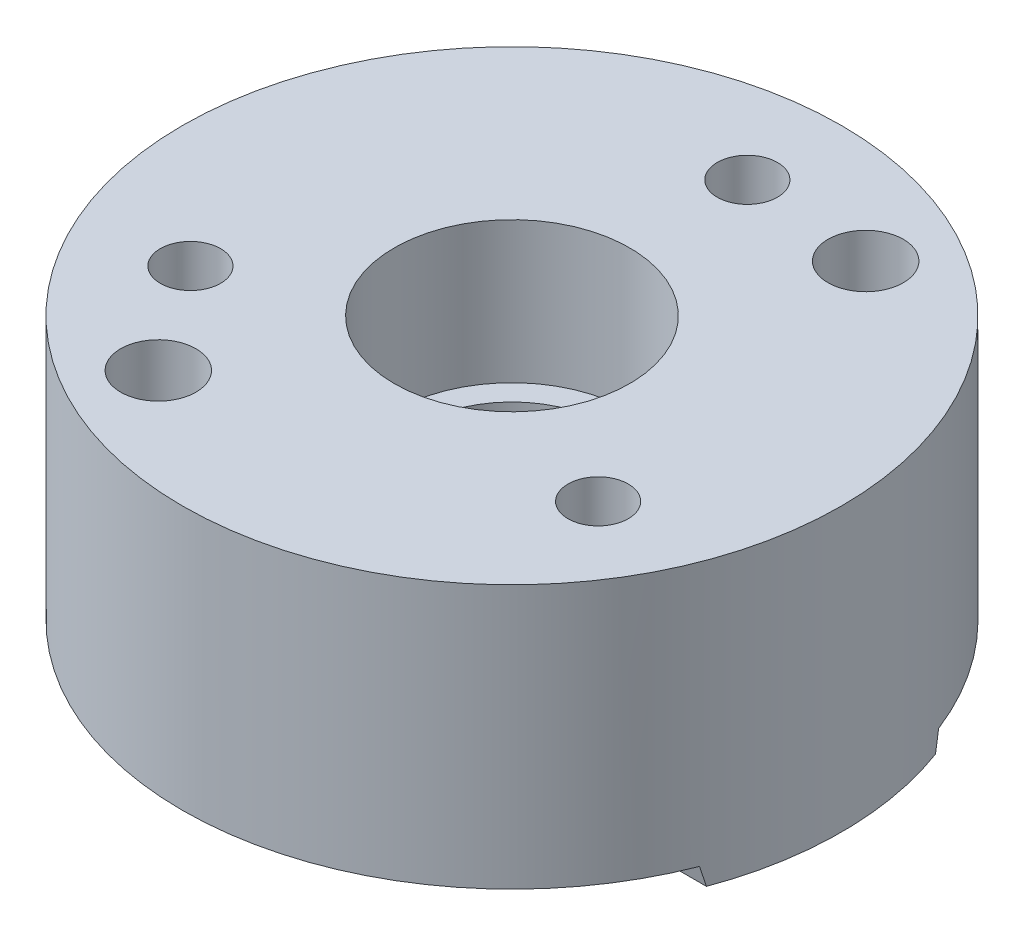
ISO-10303-21;
HEADER;
FILE_DESCRIPTION(('STEP AP214'),'2;1');
FILE_NAME('part.step','',(''),(''),'','','');
FILE_SCHEMA(('AUTOMOTIVE_DESIGN { 1 0 10303 214 1 1 1 1 }'));
ENDSEC;
DATA;
#1=APPLICATION_CONTEXT('core data for automotive mechanical design processes');
#2=APPLICATION_PROTOCOL_DEFINITION('international standard','automotive_design',2000,#1);
#3=PRODUCT_CONTEXT('',#1,'mechanical');
#4=PRODUCT('Part','Part','',(#3));
#5=PRODUCT_RELATED_PRODUCT_CATEGORY('part','',(#4));
#6=PRODUCT_DEFINITION_FORMATION('','',#4);
#7=PRODUCT_DEFINITION_CONTEXT('part definition',#1,'design');
#8=PRODUCT_DEFINITION('design','',#6,#7);
#9=PRODUCT_DEFINITION_SHAPE('','',#8);
#10=(LENGTH_UNIT() NAMED_UNIT(*) SI_UNIT(.MILLI.,.METRE.));
#11=(NAMED_UNIT(*) PLANE_ANGLE_UNIT() SI_UNIT($,.RADIAN.));
#12=(NAMED_UNIT(*) SI_UNIT($,.STERADIAN.) SOLID_ANGLE_UNIT());
#13=UNCERTAINTY_MEASURE_WITH_UNIT(LENGTH_MEASURE(1.E-05),#10,'distance_accuracy_value','');
#14=(GEOMETRIC_REPRESENTATION_CONTEXT(3) GLOBAL_UNCERTAINTY_ASSIGNED_CONTEXT((#13)) GLOBAL_UNIT_ASSIGNED_CONTEXT((#10,
#11,#12)) REPRESENTATION_CONTEXT('',''));
#15=CARTESIAN_POINT('',(0.,0.,0.));
#16=DIRECTION('',(0.,0.,1.));
#17=DIRECTION('',(1.,0.,0.));
#18=AXIS2_PLACEMENT_3D('',#15,#16,#17);
#19=CARTESIAN_POINT('',(-35.,-28.,-12.7));
#20=DIRECTION('',(0.,0.258819045102513,0.96592582628907));
#21=DIRECTION('',(0.,-0.96592582628907,0.258819045102513));
#22=AXIS2_PLACEMENT_3D('',#19,#20,#21);
#23=PLANE('',#22);
#24=DIRECTION('',(1.,0.,0.));
#25=VECTOR('',#24,1.);
#26=CARTESIAN_POINT('',(-35.,-30.,-12.1641016151378));
#27=LINE('',#26,#25);
#28=CARTESIAN_POINT('',(12.4349134958032,-30.,-12.1641016151378));
#29=VERTEX_POINT('',#28);
#30=CARTESIAN_POINT('',(32.8182057994736,-30.,-12.1641016151378));
#31=VERTEX_POINT('',#30);
#32=EDGE_CURVE('E183',#29,#31,#27,.T.);
#33=ORIENTED_EDGE('',*,*,#32,.F.);
#34=CARTESIAN_POINT('',(0.,-64.000168112461,-3.05378402688174));
#35=DIRECTION('',(0.,0.258819045102513,0.96592582628907));
#36=DIRECTION('',(0.,0.96592582628907,-0.258819045102513));
#37=AXIS2_PLACEMENT_3D('',#34,#35,#36);
#38=ELLIPSE('',#37,60.325201838318,15.3117565200167);
#39=CARTESIAN_POINT('',(12.0399335546339,-28.,-12.7));
#40=VERTEX_POINT('',#39);
#41=EDGE_CURVE('E12',#29,#40,#38,.T.);
#42=ORIENTED_EDGE('',*,*,#41,.T.);
#43=DIRECTION('',(1.,0.,0.));
#44=VECTOR('',#43,1.);
#45=CARTESIAN_POINT('',(-35.,-28.,-12.7));
#46=LINE('',#45,#44);
#47=CARTESIAN_POINT('',(32.6145672974516,-28.,-12.7));
#48=VERTEX_POINT('',#47);
#49=EDGE_CURVE('E209',#40,#48,#46,.T.);
#50=ORIENTED_EDGE('',*,*,#49,.T.);
#51=CARTESIAN_POINT('',(0.,-75.3970452561262,0.));
#52=DIRECTION('',(0.,0.258819045102513,0.96592582628907));
#53=DIRECTION('',(0.,0.96592582628907,-0.258819045102513));
#54=AXIS2_PLACEMENT_3D('',#51,#52,#53);
#55=ELLIPSE('',#54,135.229615680474,35.);
#56=EDGE_CURVE('E185',#48,#31,#55,.F.);
#57=ORIENTED_EDGE('',*,*,#56,.T.);
#58=EDGE_LOOP('',(#33,#42,#50,#57));
#59=FACE_BOUND('',#58,.T.);
#60=ADVANCED_FACE('F42',(#59),#23,.F.);
#61=CARTESIAN_POINT('',(-35.,-28.,12.7));
#62=DIRECTION('',(0.,0.258819045102515,-0.96592582628907));
#63=DIRECTION('',(0.,0.96592582628907,0.258819045102515));
#64=AXIS2_PLACEMENT_3D('',#61,#62,#63);
#65=PLANE('',#64);
#66=DIRECTION('',(1.,0.,0.));
#67=VECTOR('',#66,1.);
#68=CARTESIAN_POINT('',(-35.,-30.,12.1641016151378));
#69=LINE('',#68,#67);
#70=CARTESIAN_POINT('',(-16.1609017427034,-30.,12.1641016151378));
#71=VERTEX_POINT('',#70);
#72=CARTESIAN_POINT('',(-12.5811220444205,-30.,12.1641016151378));
#73=VERTEX_POINT('',#72);
#74=EDGE_CURVE('E67',#71,#73,#69,.T.);
#75=ORIENTED_EDGE('',*,*,#74,.T.);
#76=CARTESIAN_POINT('',(0.,-75.3970452561259,0.));
#77=DIRECTION('',(0.,0.258819045102515,-0.96592582628907));
#78=DIRECTION('',(0.,-0.96592582628907,-0.258819045102515));
#79=AXIS2_PLACEMENT_3D('',#76,#77,#78);
#80=ELLIPSE('',#79,67.6148078402364,17.5);
#81=CARTESIAN_POINT('',(-12.0399335546339,-28.,12.7));
#82=VERTEX_POINT('',#81);
#83=EDGE_CURVE('E162',#73,#82,#80,.T.);
#84=ORIENTED_EDGE('',*,*,#83,.T.);
#85=DIRECTION('',(-1.,0.,0.));
#86=VECTOR('',#85,1.);
#87=CARTESIAN_POINT('',(-35.,-28.,12.7));
#88=LINE('',#87,#86);
#89=CARTESIAN_POINT('',(-16.1542726611465,-28.,12.7));
#90=VERTEX_POINT('',#89);
#91=EDGE_CURVE('E145',#82,#90,#88,.T.);
#92=ORIENTED_EDGE('',*,*,#91,.T.);
#93=CARTESIAN_POINT('',(-21.650635094611,-28.746410161514,12.4999999999999));
#94=DIRECTION('',(0.,0.258819045102515,-0.96592582628907));
#95=DIRECTION('',(0.,-0.96592582628907,-0.258819045102515));
#96=AXIS2_PLACEMENT_3D('',#93,#94,#95);
#97=ELLIPSE('',#96,21.25036817836,5.5);
#98=EDGE_CURVE('E195',#71,#90,#97,.F.);
#99=ORIENTED_EDGE('',*,*,#98,.F.);
#100=EDGE_LOOP('',(#75,#84,#92,#99));
#101=FACE_BOUND('',#100,.T.);
#102=ADVANCED_FACE('F300',(#101),#65,.F.);
#103=CARTESIAN_POINT('',(0.,-30.,0.));
#104=DIRECTION('',(0.,1.,0.));
#105=DIRECTION('',(0.,0.,1.));
#106=AXIS2_PLACEMENT_3D('',#103,#104,#105);
#107=CYLINDRICAL_SURFACE('',#106,35.);
#108=ORIENTED_EDGE('',*,*,#56,.F.);
#109=CARTESIAN_POINT('',(0.,-28.,0.));
#110=DIRECTION('',(0.,-1.,0.));
#111=DIRECTION('',(0.,0.,-1.));
#112=AXIS2_PLACEMENT_3D('',#109,#110,#111);
#113=CIRCLE('',#112,35.);
#114=CARTESIAN_POINT('',(-32.6145672974516,-28.,-12.7));
#115=VERTEX_POINT('',#114);
#116=EDGE_CURVE('E220',#48,#115,#113,.F.);
#117=ORIENTED_EDGE('',*,*,#116,.T.);
#118=CARTESIAN_POINT('',(-32.8182057994736,-30.,-12.1641016151378));
#119=VERTEX_POINT('',#118);
#120=EDGE_CURVE('E182',#119,#115,#55,.F.);
#121=ORIENTED_EDGE('',*,*,#120,.F.);
#122=CARTESIAN_POINT('',(0.,-30.,0.));
#123=DIRECTION('',(0.,1.,0.));
#124=DIRECTION('',(0.,0.,1.));
#125=AXIS2_PLACEMENT_3D('',#122,#123,#124);
#126=CIRCLE('',#125,35.);
#127=CARTESIAN_POINT('',(-32.8182057994736,-30.,12.1641016151378));
#128=VERTEX_POINT('',#127);
#129=EDGE_CURVE('E166',#119,#128,#126,.T.);
#130=ORIENTED_EDGE('',*,*,#129,.T.);
#131=CARTESIAN_POINT('',(0.,-75.3970452561259,0.));
#132=DIRECTION('',(0.,0.258819045102515,-0.96592582628907));
#133=DIRECTION('',(0.,0.96592582628907,0.258819045102515));
#134=AXIS2_PLACEMENT_3D('',#131,#132,#133);
#135=ELLIPSE('',#134,135.229615680473,35.);
#136=CARTESIAN_POINT('',(-32.6145672974516,-28.,12.7));
#137=VERTEX_POINT('',#136);
#138=EDGE_CURVE('E200',#137,#128,#135,.F.);
#139=ORIENTED_EDGE('',*,*,#138,.F.);
#140=CARTESIAN_POINT('',(32.6145672974516,-28.,12.7));
#141=VERTEX_POINT('',#140);
#142=EDGE_CURVE('E223',#137,#141,#113,.F.);
#143=ORIENTED_EDGE('',*,*,#142,.T.);
#144=CARTESIAN_POINT('',(32.8182057994736,-30.,12.1641016151378));
#145=VERTEX_POINT('',#144);
#146=EDGE_CURVE('E198',#145,#141,#135,.F.);
#147=ORIENTED_EDGE('',*,*,#146,.F.);
#148=EDGE_CURVE('E163',#145,#31,#126,.T.);
#149=ORIENTED_EDGE('',*,*,#148,.T.);
#150=EDGE_LOOP('',(#108,#117,#121,#130,#139,#143,#147,#149));
#151=FACE_BOUND('',#150,.T.);
#152=CARTESIAN_POINT('',(0.,0.,0.));
#153=DIRECTION('',(0.,1.,0.));
#154=DIRECTION('',(0.,0.,1.));
#155=AXIS2_PLACEMENT_3D('',#152,#153,#154);
#156=CIRCLE('',#155,35.);
#157=CARTESIAN_POINT('',(0.,0.,35.));
#158=VERTEX_POINT('',#157);
#159=EDGE_CURVE('E272',#158,#158,#156,.T.);
#160=ORIENTED_EDGE('',*,*,#159,.F.);
#161=EDGE_LOOP('',(#160));
#162=FACE_BOUND('',#161,.T.);
#163=ADVANCED_FACE('F308',(#151,#162),#107,.T.);
#164=CARTESIAN_POINT('',(0.,-30.,0.));
#165=DIRECTION('',(0.,1.,0.));
#166=DIRECTION('',(0.,0.,1.));
#167=AXIS2_PLACEMENT_3D('',#164,#165,#166);
#168=PLANE('',#167);
#169=CARTESIAN_POINT('',(-13.665,-30.,0.));
#170=DIRECTION('',(0.,-1.,0.));
#171=DIRECTION('',(0.,0.,-1.));
#172=AXIS2_PLACEMENT_3D('',#169,#170,#171);
#173=CIRCLE('',#172,2.1);
#174=CARTESIAN_POINT('',(-13.665,-30.,-2.1));
#175=VERTEX_POINT('',#174);
#176=EDGE_CURVE('E205',#175,#175,#173,.T.);
#177=ORIENTED_EDGE('',*,*,#176,.F.);
#178=EDGE_LOOP('',(#177));
#179=FACE_BOUND('',#178,.T.);
#180=CARTESIAN_POINT('',(0.,-30.,0.));
#181=DIRECTION('',(0.,1.,0.));
#182=DIRECTION('',(0.,0.,1.));
#183=AXIS2_PLACEMENT_3D('',#180,#181,#182);
#184=CIRCLE('',#183,10.);
#185=CARTESIAN_POINT('',(0.,-30.,10.));
#186=VERTEX_POINT('',#185);
#187=EDGE_CURVE('E270',#186,#186,#184,.T.);
#188=ORIENTED_EDGE('',*,*,#187,.T.);
#189=EDGE_LOOP('',(#188));
#190=FACE_BOUND('',#189,.T.);
#191=ORIENTED_EDGE('',*,*,#129,.F.);
#192=CARTESIAN_POINT('',(-12.4349134958032,-30.,-12.1641016151378));
#193=VERTEX_POINT('',#192);
#194=EDGE_CURVE('E174',#119,#193,#27,.T.);
#195=ORIENTED_EDGE('',*,*,#194,.T.);
#196=CARTESIAN_POINT('',(0.,-30.,0.));
#197=DIRECTION('',(0.,1.,0.));
#198=DIRECTION('',(0.,0.,1.));
#199=AXIS2_PLACEMENT_3D('',#196,#197,#198);
#200=CIRCLE('',#199,17.3951844414339);
#201=EDGE_CURVE('E46',#193,#29,#200,.F.);
#202=ORIENTED_EDGE('',*,*,#201,.T.);
#203=ORIENTED_EDGE('',*,*,#32,.T.);
#204=ORIENTED_EDGE('',*,*,#148,.F.);
#205=CARTESIAN_POINT('',(27.1403684465186,-30.,12.1641016151378));
#206=VERTEX_POINT('',#205);
#207=EDGE_CURVE('E148',#206,#145,#69,.T.);
#208=ORIENTED_EDGE('',*,*,#207,.F.);
#209=CARTESIAN_POINT('',(21.650635094611,-30.,12.5));
#210=DIRECTION('',(0.,-1.,0.));
#211=DIRECTION('',(0.,0.,-1.));
#212=AXIS2_PLACEMENT_3D('',#209,#210,#211);
#213=CIRCLE('',#212,5.5);
#214=CARTESIAN_POINT('',(16.1609017427034,-30.,12.1641016151378));
#215=VERTEX_POINT('',#214);
#216=EDGE_CURVE('E251',#215,#206,#213,.T.);
#217=ORIENTED_EDGE('',*,*,#216,.F.);
#218=CARTESIAN_POINT('',(12.5811220444205,-30.,12.1641016151378));
#219=VERTEX_POINT('',#218);
#220=EDGE_CURVE('E190',#219,#215,#69,.T.);
#221=ORIENTED_EDGE('',*,*,#220,.F.);
#222=CARTESIAN_POINT('',(0.,-30.,0.));
#223=DIRECTION('',(0.,-1.,0.));
#224=DIRECTION('',(0.,0.,-1.));
#225=AXIS2_PLACEMENT_3D('',#222,#223,#224);
#226=CIRCLE('',#225,17.5);
#227=EDGE_CURVE('E149',#219,#73,#226,.T.);
#228=ORIENTED_EDGE('',*,*,#227,.T.);
#229=ORIENTED_EDGE('',*,*,#74,.F.);
#230=CARTESIAN_POINT('',(-21.650635094611,-30.,12.4999999999999));
#231=DIRECTION('',(0.,-1.,0.));
#232=DIRECTION('',(0.,0.,-1.));
#233=AXIS2_PLACEMENT_3D('',#230,#231,#232);
#234=CIRCLE('',#233,5.5);
#235=CARTESIAN_POINT('',(-27.1403684465186,-30.,12.1641016151378));
#236=VERTEX_POINT('',#235);
#237=EDGE_CURVE('E239',#236,#71,#234,.T.);
#238=ORIENTED_EDGE('',*,*,#237,.F.);
#239=EDGE_CURVE('E187',#128,#236,#69,.T.);
#240=ORIENTED_EDGE('',*,*,#239,.F.);
#241=EDGE_LOOP('',(#191,#195,#202,#203,#204,#208,#217,#221,#228,#229,#238,#240));
#242=FACE_BOUND('',#241,.T.);
#243=ADVANCED_FACE('F179',(#179,#190,#242),#168,.F.);
#244=CARTESIAN_POINT('',(21.650635094611,-30.,12.5));
#245=DIRECTION('',(0.,-1.,0.));
#246=DIRECTION('',(0.,0.,-1.));
#247=AXIS2_PLACEMENT_3D('',#244,#245,#246);
#248=CYLINDRICAL_SURFACE('',#247,5.5);
#249=CARTESIAN_POINT('',(21.650635094611,-21.6,12.5));
#250=DIRECTION('',(0.,-1.,0.));
#251=DIRECTION('',(0.,0.,-1.));
#252=AXIS2_PLACEMENT_3D('',#249,#250,#251);
#253=CIRCLE('',#252,5.5);
#254=CARTESIAN_POINT('',(21.650635094611,-21.6,6.99999999999996));
#255=VERTEX_POINT('',#254);
#256=EDGE_CURVE('E254',#255,#255,#253,.T.);
#257=ORIENTED_EDGE('',*,*,#256,.F.);
#258=EDGE_LOOP('',(#257));
#259=FACE_BOUND('',#258,.T.);
#260=ORIENTED_EDGE('',*,*,#216,.T.);
#261=CARTESIAN_POINT('',(21.650635094611,-28.7464101615139,12.5));
#262=DIRECTION('',(0.,0.258819045102515,-0.96592582628907));
#263=DIRECTION('',(0.,-0.96592582628907,-0.258819045102515));
#264=AXIS2_PLACEMENT_3D('',#261,#262,#263);
#265=ELLIPSE('',#264,21.25036817836,5.5);
#266=CARTESIAN_POINT('',(27.1469975280755,-28.,12.7));
#267=VERTEX_POINT('',#266);
#268=EDGE_CURVE('E197',#206,#267,#265,.F.);
#269=ORIENTED_EDGE('',*,*,#268,.T.);
#270=CARTESIAN_POINT('',(21.650635094611,-28.,12.5));
#271=DIRECTION('',(0.,-1.,0.));
#272=DIRECTION('',(0.,0.,-1.));
#273=AXIS2_PLACEMENT_3D('',#270,#271,#272);
#274=CIRCLE('',#273,5.5);
#275=CARTESIAN_POINT('',(16.1542726611465,-28.,12.7));
#276=VERTEX_POINT('',#275);
#277=EDGE_CURVE('E218',#276,#267,#274,.F.);
#278=ORIENTED_EDGE('',*,*,#277,.F.);
#279=EDGE_CURVE('E157',#276,#215,#265,.F.);
#280=ORIENTED_EDGE('',*,*,#279,.T.);
#281=EDGE_LOOP('',(#260,#269,#278,#280));
#282=FACE_BOUND('',#281,.T.);
#283=ADVANCED_FACE('F354',(#259,#282),#248,.F.);
#284=CARTESIAN_POINT('',(-21.650635094611,-30.,12.4999999999999));
#285=DIRECTION('',(0.,-1.,0.));
#286=DIRECTION('',(0.,0.,-1.));
#287=AXIS2_PLACEMENT_3D('',#284,#285,#286);
#288=CYLINDRICAL_SURFACE('',#287,5.5);
#289=CARTESIAN_POINT('',(-21.650635094611,-21.6,12.4999999999999));
#290=DIRECTION('',(0.,-1.,0.));
#291=DIRECTION('',(0.,0.,-1.));
#292=AXIS2_PLACEMENT_3D('',#289,#290,#291);
#293=CIRCLE('',#292,5.5);
#294=CARTESIAN_POINT('',(-21.650635094611,-21.6,6.99999999999995));
#295=VERTEX_POINT('',#294);
#296=EDGE_CURVE('E242',#295,#295,#293,.T.);
#297=ORIENTED_EDGE('',*,*,#296,.F.);
#298=EDGE_LOOP('',(#297));
#299=FACE_BOUND('',#298,.T.);
#300=ORIENTED_EDGE('',*,*,#237,.T.);
#301=ORIENTED_EDGE('',*,*,#98,.T.);
#302=CARTESIAN_POINT('',(-21.650635094611,-28.,12.4999999999999));
#303=DIRECTION('',(0.,-1.,0.));
#304=DIRECTION('',(0.,0.,-1.));
#305=AXIS2_PLACEMENT_3D('',#302,#303,#304);
#306=CIRCLE('',#305,5.5);
#307=CARTESIAN_POINT('',(-27.1469975280755,-28.,12.7));
#308=VERTEX_POINT('',#307);
#309=EDGE_CURVE('E216',#308,#90,#306,.F.);
#310=ORIENTED_EDGE('',*,*,#309,.F.);
#311=EDGE_CURVE('E192',#308,#236,#97,.F.);
#312=ORIENTED_EDGE('',*,*,#311,.T.);
#313=EDGE_LOOP('',(#300,#301,#310,#312));
#314=FACE_BOUND('',#313,.T.);
#315=ADVANCED_FACE('F342',(#299,#314),#288,.F.);
#316=CARTESIAN_POINT('',(0.,-30.,-25.));
#317=DIRECTION('',(0.,-1.,0.));
#318=DIRECTION('',(0.,0.,-1.));
#319=AXIS2_PLACEMENT_3D('',#316,#317,#318);
#320=CYLINDRICAL_SURFACE('',#319,5.5);
#321=CARTESIAN_POINT('',(0.,-21.6,-25.));
#322=DIRECTION('',(0.,-1.,0.));
#323=DIRECTION('',(0.,0.,-1.));
#324=AXIS2_PLACEMENT_3D('',#321,#322,#323);
#325=CIRCLE('',#324,5.5);
#326=CARTESIAN_POINT('',(0.,-21.6,-30.5));
#327=VERTEX_POINT('',#326);
#328=EDGE_CURVE('E230',#327,#327,#325,.T.);
#329=ORIENTED_EDGE('',*,*,#328,.F.);
#330=EDGE_LOOP('',(#329));
#331=FACE_BOUND('',#330,.T.);
#332=CARTESIAN_POINT('',(0.,-28.,-25.));
#333=DIRECTION('',(0.,-1.,0.));
#334=DIRECTION('',(0.,0.,-1.));
#335=AXIS2_PLACEMENT_3D('',#332,#333,#334);
#336=CIRCLE('',#335,5.5);
#337=CARTESIAN_POINT('',(0.,-28.,-30.5));
#338=VERTEX_POINT('',#337);
#339=EDGE_CURVE('E213',#338,#338,#336,.F.);
#340=ORIENTED_EDGE('',*,*,#339,.F.);
#341=EDGE_LOOP('',(#340));
#342=FACE_BOUND('',#341,.T.);
#343=ADVANCED_FACE('F338',(#331,#342),#320,.F.);
#344=CARTESIAN_POINT('',(13.75,-30.,-23.815698604072));
#345=DIRECTION('',(0.,-1.,0.));
#346=DIRECTION('',(0.,0.,-1.));
#347=AXIS2_PLACEMENT_3D('',#344,#345,#346);
#348=CYLINDRICAL_SURFACE('',#347,4.);
#349=CARTESIAN_POINT('',(13.75,0.,-23.815698604072));
#350=DIRECTION('',(0.,-1.,0.));
#351=DIRECTION('',(0.,0.,-1.));
#352=AXIS2_PLACEMENT_3D('',#349,#350,#351);
#353=CIRCLE('',#352,3.99999999999999);
#354=CARTESIAN_POINT('',(13.75,0.,-27.815698604072));
#355=VERTEX_POINT('',#354);
#356=EDGE_CURVE('E227',#355,#355,#353,.T.);
#357=ORIENTED_EDGE('',*,*,#356,.F.);
#358=EDGE_LOOP('',(#357));
#359=FACE_BOUND('',#358,.T.);
#360=CARTESIAN_POINT('',(13.75,-28.,-23.815698604072));
#361=DIRECTION('',(0.,-1.,0.));
#362=DIRECTION('',(0.,0.,-1.));
#363=AXIS2_PLACEMENT_3D('',#360,#361,#362);
#364=CIRCLE('',#363,4.);
#365=CARTESIAN_POINT('',(13.75,-28.,-27.815698604072));
#366=VERTEX_POINT('',#365);
#367=EDGE_CURVE('E210',#366,#366,#364,.F.);
#368=ORIENTED_EDGE('',*,*,#367,.F.);
#369=EDGE_LOOP('',(#368));
#370=FACE_BOUND('',#369,.T.);
#371=ADVANCED_FACE('F293',(#359,#370),#348,.F.);
#372=CARTESIAN_POINT('',(-13.75,-30.,23.815698604072));
#373=DIRECTION('',(0.,-1.,0.));
#374=DIRECTION('',(0.,0.,-1.));
#375=AXIS2_PLACEMENT_3D('',#372,#373,#374);
#376=CYLINDRICAL_SURFACE('',#375,4.);
#377=CARTESIAN_POINT('',(-13.75,0.,23.815698604072));
#378=DIRECTION('',(0.,-1.,0.));
#379=DIRECTION('',(0.,0.,-1.));
#380=AXIS2_PLACEMENT_3D('',#377,#378,#379);
#381=CIRCLE('',#380,3.99999999999999);
#382=CARTESIAN_POINT('',(-13.75,0.,19.8156986040721));
#383=VERTEX_POINT('',#382);
#384=EDGE_CURVE('E224',#383,#383,#381,.T.);
#385=ORIENTED_EDGE('',*,*,#384,.F.);
#386=EDGE_LOOP('',(#385));
#387=FACE_BOUND('',#386,.T.);
#388=CARTESIAN_POINT('',(-13.75,-28.,23.815698604072));
#389=DIRECTION('',(0.,-1.,0.));
#390=DIRECTION('',(0.,0.,-1.));
#391=AXIS2_PLACEMENT_3D('',#388,#389,#390);
#392=CIRCLE('',#391,4.);
#393=CARTESIAN_POINT('',(-13.75,-28.,19.8156986040721));
#394=VERTEX_POINT('',#393);
#395=EDGE_CURVE('E169',#394,#394,#392,.F.);
#396=ORIENTED_EDGE('',*,*,#395,.F.);
#397=EDGE_LOOP('',(#396));
#398=FACE_BOUND('',#397,.T.);
#399=ADVANCED_FACE('F283',(#387,#398),#376,.F.);
#400=CARTESIAN_POINT('',(0.,-30.,0.));
#401=DIRECTION('',(0.,1.,0.));
#402=DIRECTION('',(0.,0.,1.));
#403=AXIS2_PLACEMENT_3D('',#400,#401,#402);
#404=CYLINDRICAL_SURFACE('',#403,10.);
#405=ORIENTED_EDGE('',*,*,#187,.F.);
#406=EDGE_LOOP('',(#405));
#407=FACE_BOUND('',#406,.T.);
#408=CARTESIAN_POINT('',(0.,-15.,0.));
#409=DIRECTION('',(0.,1.,0.));
#410=DIRECTION('',(0.,0.,1.));
#411=AXIS2_PLACEMENT_3D('',#408,#409,#410);
#412=CIRCLE('',#411,10.);
#413=CARTESIAN_POINT('',(0.,-15.,10.));
#414=VERTEX_POINT('',#413);
#415=EDGE_CURVE('E267',#414,#414,#412,.F.);
#416=ORIENTED_EDGE('',*,*,#415,.F.);
#417=EDGE_LOOP('',(#416));
#418=FACE_BOUND('',#417,.T.);
#419=ADVANCED_FACE('F280',(#407,#418),#404,.F.);
#420=CARTESIAN_POINT('',(0.,0.,0.));
#421=DIRECTION('',(0.,1.,0.));
#422=DIRECTION('',(0.,0.,1.));
#423=AXIS2_PLACEMENT_3D('',#420,#421,#422);
#424=PLANE('',#423);
#425=ORIENTED_EDGE('',*,*,#384,.T.);
#426=EDGE_LOOP('',(#425));
#427=FACE_BOUND('',#426,.T.);
#428=ORIENTED_EDGE('',*,*,#356,.T.);
#429=EDGE_LOOP('',(#428));
#430=FACE_BOUND('',#429,.T.);
#431=CARTESIAN_POINT('',(0.,0.,-25.));
#432=DIRECTION('',(0.,-1.,0.));
#433=DIRECTION('',(0.,0.,-1.));
#434=AXIS2_PLACEMENT_3D('',#431,#432,#433);
#435=CIRCLE('',#434,3.19999999999999);
#436=CARTESIAN_POINT('',(0.,0.,-28.2));
#437=VERTEX_POINT('',#436);
#438=EDGE_CURVE('E236',#437,#437,#435,.T.);
#439=ORIENTED_EDGE('',*,*,#438,.T.);
#440=EDGE_LOOP('',(#439));
#441=FACE_BOUND('',#440,.T.);
#442=CARTESIAN_POINT('',(-21.650635094611,0.,12.4999999999999));
#443=DIRECTION('',(0.,-1.,0.));
#444=DIRECTION('',(0.,0.,-1.));
#445=AXIS2_PLACEMENT_3D('',#442,#443,#444);
#446=CIRCLE('',#445,3.19999999999999);
#447=CARTESIAN_POINT('',(-21.650635094611,0.,9.29999999999995));
#448=VERTEX_POINT('',#447);
#449=EDGE_CURVE('E248',#448,#448,#446,.T.);
#450=ORIENTED_EDGE('',*,*,#449,.T.);
#451=EDGE_LOOP('',(#450));
#452=FACE_BOUND('',#451,.T.);
#453=CARTESIAN_POINT('',(21.650635094611,0.,12.5));
#454=DIRECTION('',(0.,-1.,0.));
#455=DIRECTION('',(0.,0.,-1.));
#456=AXIS2_PLACEMENT_3D('',#453,#454,#455);
#457=CIRCLE('',#456,3.19999999999999);
#458=CARTESIAN_POINT('',(21.650635094611,0.,9.29999999999997));
#459=VERTEX_POINT('',#458);
#460=EDGE_CURVE('E260',#459,#459,#457,.T.);
#461=ORIENTED_EDGE('',*,*,#460,.T.);
#462=EDGE_LOOP('',(#461));
#463=FACE_BOUND('',#462,.T.);
#464=CARTESIAN_POINT('',(0.,0.,0.));
#465=DIRECTION('',(0.,1.,0.));
#466=DIRECTION('',(0.,0.,1.));
#467=AXIS2_PLACEMENT_3D('',#464,#465,#466);
#468=CIRCLE('',#467,12.5);
#469=CARTESIAN_POINT('',(0.,0.,12.5));
#470=VERTEX_POINT('',#469);
#471=EDGE_CURVE('E263',#470,#470,#468,.T.);
#472=ORIENTED_EDGE('',*,*,#471,.F.);
#473=EDGE_LOOP('',(#472));
#474=FACE_BOUND('',#473,.T.);
#475=ORIENTED_EDGE('',*,*,#159,.T.);
#476=EDGE_LOOP('',(#475));
#477=FACE_BOUND('',#476,.T.);
#478=ADVANCED_FACE('F282',(#427,#430,#441,#452,#463,#474,#477),#424,.T.);
#479=CARTESIAN_POINT('',(0.,-15.,0.));
#480=DIRECTION('',(0.,1.,0.));
#481=DIRECTION('',(0.,0.,1.));
#482=AXIS2_PLACEMENT_3D('',#479,#480,#481);
#483=PLANE('',#482);
#484=CARTESIAN_POINT('',(0.,-15.,0.));
#485=DIRECTION('',(0.,1.,0.));
#486=DIRECTION('',(0.,0.,1.));
#487=AXIS2_PLACEMENT_3D('',#484,#485,#486);
#488=CIRCLE('',#487,12.5);
#489=CARTESIAN_POINT('',(0.,-15.,12.5));
#490=VERTEX_POINT('',#489);
#491=EDGE_CURVE('E264',#490,#490,#488,.T.);
#492=ORIENTED_EDGE('',*,*,#491,.T.);
#493=EDGE_LOOP('',(#492));
#494=FACE_BOUND('',#493,.T.);
#495=ORIENTED_EDGE('',*,*,#415,.T.);
#496=EDGE_LOOP('',(#495));
#497=FACE_BOUND('',#496,.T.);
#498=ADVANCED_FACE('F278',(#494,#497),#483,.T.);
#499=CARTESIAN_POINT('',(0.,-15.,0.));
#500=DIRECTION('',(0.,1.,0.));
#501=DIRECTION('',(0.,0.,1.));
#502=AXIS2_PLACEMENT_3D('',#499,#500,#501);
#503=CYLINDRICAL_SURFACE('',#502,12.5);
#504=ORIENTED_EDGE('',*,*,#491,.F.);
#505=EDGE_LOOP('',(#504));
#506=FACE_BOUND('',#505,.T.);
#507=ORIENTED_EDGE('',*,*,#471,.T.);
#508=EDGE_LOOP('',(#507));
#509=FACE_BOUND('',#508,.T.);
#510=ADVANCED_FACE('F373',(#506,#509),#503,.F.);
#511=CARTESIAN_POINT('',(21.650635094611,-30.,12.5));
#512=DIRECTION('',(0.,-1.,0.));
#513=DIRECTION('',(0.,0.,-1.));
#514=AXIS2_PLACEMENT_3D('',#511,#512,#513);
#515=CYLINDRICAL_SURFACE('',#514,3.2);
#516=ORIENTED_EDGE('',*,*,#460,.F.);
#517=EDGE_LOOP('',(#516));
#518=FACE_BOUND('',#517,.T.);
#519=CARTESIAN_POINT('',(21.650635094611,-21.6,12.5));
#520=DIRECTION('',(0.,-1.,0.));
#521=DIRECTION('',(0.,0.,-1.));
#522=AXIS2_PLACEMENT_3D('',#519,#520,#521);
#523=CIRCLE('',#522,3.2);
#524=CARTESIAN_POINT('',(21.650635094611,-21.6,9.29999999999996));
#525=VERTEX_POINT('',#524);
#526=EDGE_CURVE('E257',#525,#525,#523,.T.);
#527=ORIENTED_EDGE('',*,*,#526,.T.);
#528=EDGE_LOOP('',(#527));
#529=FACE_BOUND('',#528,.T.);
#530=ADVANCED_FACE('F369',(#518,#529),#515,.F.);
#531=CARTESIAN_POINT('',(24.850635094611,-21.6,12.5));
#532=DIRECTION('',(0.,1.,0.));
#533=DIRECTION('',(0.,0.,1.));
#534=AXIS2_PLACEMENT_3D('',#531,#532,#533);
#535=PLANE('',#534);
#536=ORIENTED_EDGE('',*,*,#526,.F.);
#537=EDGE_LOOP('',(#536));
#538=FACE_BOUND('',#537,.T.);
#539=ORIENTED_EDGE('',*,*,#256,.T.);
#540=EDGE_LOOP('',(#539));
#541=FACE_BOUND('',#540,.T.);
#542=ADVANCED_FACE('F362',(#538,#541),#535,.F.);
#543=CARTESIAN_POINT('',(-21.650635094611,-30.,12.4999999999999));
#544=DIRECTION('',(0.,-1.,0.));
#545=DIRECTION('',(0.,0.,-1.));
#546=AXIS2_PLACEMENT_3D('',#543,#544,#545);
#547=CYLINDRICAL_SURFACE('',#546,3.2);
#548=ORIENTED_EDGE('',*,*,#449,.F.);
#549=EDGE_LOOP('',(#548));
#550=FACE_BOUND('',#549,.T.);
#551=CARTESIAN_POINT('',(-21.650635094611,-21.6,12.4999999999999));
#552=DIRECTION('',(0.,-1.,0.));
#553=DIRECTION('',(0.,0.,-1.));
#554=AXIS2_PLACEMENT_3D('',#551,#552,#553);
#555=CIRCLE('',#554,3.2);
#556=CARTESIAN_POINT('',(-21.650635094611,-21.6,9.29999999999994));
#557=VERTEX_POINT('',#556);
#558=EDGE_CURVE('E245',#557,#557,#555,.T.);
#559=ORIENTED_EDGE('',*,*,#558,.T.);
#560=EDGE_LOOP('',(#559));
#561=FACE_BOUND('',#560,.T.);
#562=ADVANCED_FACE('F358',(#550,#561),#547,.F.);
#563=CARTESIAN_POINT('',(-18.450635094611,-21.6,12.4999999999999));
#564=DIRECTION('',(0.,1.,0.));
#565=DIRECTION('',(0.,0.,1.));
#566=AXIS2_PLACEMENT_3D('',#563,#564,#565);
#567=PLANE('',#566);
#568=ORIENTED_EDGE('',*,*,#558,.F.);
#569=EDGE_LOOP('',(#568));
#570=FACE_BOUND('',#569,.T.);
#571=ORIENTED_EDGE('',*,*,#296,.T.);
#572=EDGE_LOOP('',(#571));
#573=FACE_BOUND('',#572,.T.);
#574=ADVANCED_FACE('F350',(#570,#573),#567,.F.);
#575=CARTESIAN_POINT('',(0.,-30.,-25.));
#576=DIRECTION('',(0.,-1.,0.));
#577=DIRECTION('',(0.,0.,-1.));
#578=AXIS2_PLACEMENT_3D('',#575,#576,#577);
#579=CYLINDRICAL_SURFACE('',#578,3.2);
#580=ORIENTED_EDGE('',*,*,#438,.F.);
#581=EDGE_LOOP('',(#580));
#582=FACE_BOUND('',#581,.T.);
#583=CARTESIAN_POINT('',(0.,-21.6,-25.));
#584=DIRECTION('',(0.,-1.,0.));
#585=DIRECTION('',(0.,0.,-1.));
#586=AXIS2_PLACEMENT_3D('',#583,#584,#585);
#587=CIRCLE('',#586,3.2);
#588=CARTESIAN_POINT('',(0.,-21.6,-28.2));
#589=VERTEX_POINT('',#588);
#590=EDGE_CURVE('E233',#589,#589,#587,.T.);
#591=ORIENTED_EDGE('',*,*,#590,.T.);
#592=EDGE_LOOP('',(#591));
#593=FACE_BOUND('',#592,.T.);
#594=ADVANCED_FACE('F346',(#582,#593),#579,.F.);
#595=CARTESIAN_POINT('',(3.2,-21.6,-25.));
#596=DIRECTION('',(0.,1.,0.));
#597=DIRECTION('',(0.,0.,1.));
#598=AXIS2_PLACEMENT_3D('',#595,#596,#597);
#599=PLANE('',#598);
#600=ORIENTED_EDGE('',*,*,#590,.F.);
#601=EDGE_LOOP('',(#600));
#602=FACE_BOUND('',#601,.T.);
#603=ORIENTED_EDGE('',*,*,#328,.T.);
#604=EDGE_LOOP('',(#603));
#605=FACE_BOUND('',#604,.T.);
#606=ADVANCED_FACE('F334',(#602,#605),#599,.F.);
#607=CARTESIAN_POINT('',(0.,-28.,0.));
#608=DIRECTION('',(0.,-1.,0.));
#609=DIRECTION('',(0.,0.,-1.));
#610=AXIS2_PLACEMENT_3D('',#607,#608,#609);
#611=PLANE('',#610);
#612=CARTESIAN_POINT('',(0.,-28.,0.));
#613=DIRECTION('',(0.,-1.,0.));
#614=DIRECTION('',(0.,0.,-1.));
#615=AXIS2_PLACEMENT_3D('',#612,#613,#614);
#616=CIRCLE('',#615,17.5);
#617=CARTESIAN_POINT('',(12.0399335546339,-28.,12.7));
#618=VERTEX_POINT('',#617);
#619=EDGE_CURVE('E137',#82,#618,#616,.F.);
#620=ORIENTED_EDGE('',*,*,#619,.T.);
#621=EDGE_CURVE('E142',#276,#618,#88,.T.);
#622=ORIENTED_EDGE('',*,*,#621,.F.);
#623=ORIENTED_EDGE('',*,*,#277,.T.);
#624=EDGE_CURVE('E158',#141,#267,#88,.T.);
#625=ORIENTED_EDGE('',*,*,#624,.F.);
#626=ORIENTED_EDGE('',*,*,#142,.F.);
#627=EDGE_CURVE('E204',#308,#137,#88,.T.);
#628=ORIENTED_EDGE('',*,*,#627,.F.);
#629=ORIENTED_EDGE('',*,*,#309,.T.);
#630=ORIENTED_EDGE('',*,*,#91,.F.);
#631=EDGE_LOOP('',(#620,#622,#623,#625,#626,#628,#629,#630));
#632=FACE_BOUND('',#631,.T.);
#633=ORIENTED_EDGE('',*,*,#395,.T.);
#634=EDGE_LOOP('',(#633));
#635=FACE_BOUND('',#634,.T.);
#636=ADVANCED_FACE('F139',(#632,#635),#611,.T.);
#637=CARTESIAN_POINT('',(0.,-28.,0.));
#638=DIRECTION('',(0.,-1.,0.));
#639=DIRECTION('',(0.,0.,-1.));
#640=AXIS2_PLACEMENT_3D('',#637,#638,#639);
#641=CIRCLE('',#640,17.5);
#642=CARTESIAN_POINT('',(-12.0399335546339,-28.,-12.7));
#643=VERTEX_POINT('',#642);
#644=EDGE_CURVE('E81',#40,#643,#641,.F.);
#645=ORIENTED_EDGE('',*,*,#644,.T.);
#646=EDGE_CURVE('E177',#115,#643,#46,.T.);
#647=ORIENTED_EDGE('',*,*,#646,.F.);
#648=ORIENTED_EDGE('',*,*,#116,.F.);
#649=ORIENTED_EDGE('',*,*,#49,.F.);
#650=EDGE_LOOP('',(#645,#647,#648,#649));
#651=FACE_BOUND('',#650,.T.);
#652=ORIENTED_EDGE('',*,*,#367,.T.);
#653=EDGE_LOOP('',(#652));
#654=FACE_BOUND('',#653,.T.);
#655=ORIENTED_EDGE('',*,*,#339,.T.);
#656=EDGE_LOOP('',(#655));
#657=FACE_BOUND('',#656,.T.);
#658=ADVANCED_FACE('F329',(#651,#654,#657),#611,.T.);
#659=CARTESIAN_POINT('',(-13.665,-27.,0.));
#660=DIRECTION('',(0.,-1.,0.));
#661=DIRECTION('',(0.,0.,-1.));
#662=AXIS2_PLACEMENT_3D('',#659,#660,#661);
#663=CYLINDRICAL_SURFACE('',#662,2.1);
#664=CARTESIAN_POINT('',(-13.665,-27.,0.));
#665=DIRECTION('',(0.,-1.,0.));
#666=DIRECTION('',(0.,0.,-1.));
#667=AXIS2_PLACEMENT_3D('',#664,#665,#666);
#668=CIRCLE('',#667,2.1);
#669=CARTESIAN_POINT('',(-13.665,-27.,-2.1));
#670=VERTEX_POINT('',#669);
#671=EDGE_CURVE('E201',#670,#670,#668,.T.);
#672=ORIENTED_EDGE('',*,*,#671,.F.);
#673=EDGE_LOOP('',(#672));
#674=FACE_BOUND('',#673,.T.);
#675=ORIENTED_EDGE('',*,*,#176,.T.);
#676=EDGE_LOOP('',(#675));
#677=FACE_BOUND('',#676,.T.);
#678=ADVANCED_FACE('F322',(#674,#677),#663,.F.);
#679=CARTESIAN_POINT('',(-13.665,-27.,0.));
#680=DIRECTION('',(0.,-1.,0.));
#681=DIRECTION('',(0.,0.,-1.));
#682=AXIS2_PLACEMENT_3D('',#679,#680,#681);
#683=PLANE('',#682);
#684=ORIENTED_EDGE('',*,*,#671,.T.);
#685=EDGE_LOOP('',(#684));
#686=FACE_BOUND('',#685,.T.);
#687=ADVANCED_FACE('F314',(#686),#683,.T.);
#688=ORIENTED_EDGE('',*,*,#646,.T.);
#689=CARTESIAN_POINT('',(0.,-64.000168112461,-3.05378402688174));
#690=DIRECTION('',(0.,0.258819045102513,0.96592582628907));
#691=DIRECTION('',(0.,0.96592582628907,-0.258819045102513));
#692=AXIS2_PLACEMENT_3D('',#689,#690,#691);
#693=ELLIPSE('',#692,60.325201838318,15.3117565200167);
#694=EDGE_CURVE('E51',#643,#193,#693,.T.);
#695=ORIENTED_EDGE('',*,*,#694,.T.);
#696=ORIENTED_EDGE('',*,*,#194,.F.);
#697=ORIENTED_EDGE('',*,*,#120,.T.);
#698=EDGE_LOOP('',(#688,#695,#696,#697));
#699=FACE_BOUND('',#698,.T.);
#700=ADVANCED_FACE('F173',(#699),#23,.F.);
#701=ORIENTED_EDGE('',*,*,#146,.T.);
#702=ORIENTED_EDGE('',*,*,#624,.T.);
#703=ORIENTED_EDGE('',*,*,#268,.F.);
#704=ORIENTED_EDGE('',*,*,#207,.T.);
#705=EDGE_LOOP('',(#701,#702,#703,#704));
#706=FACE_BOUND('',#705,.T.);
#707=ADVANCED_FACE('F310',(#706),#65,.F.);
#708=ORIENTED_EDGE('',*,*,#138,.T.);
#709=ORIENTED_EDGE('',*,*,#239,.T.);
#710=ORIENTED_EDGE('',*,*,#311,.F.);
#711=ORIENTED_EDGE('',*,*,#627,.T.);
#712=EDGE_LOOP('',(#708,#709,#710,#711));
#713=FACE_BOUND('',#712,.T.);
#714=ADVANCED_FACE('F319',(#713),#65,.F.);
#715=ORIENTED_EDGE('',*,*,#621,.T.);
#716=EDGE_CURVE('E154',#618,#219,#80,.T.);
#717=ORIENTED_EDGE('',*,*,#716,.T.);
#718=ORIENTED_EDGE('',*,*,#220,.T.);
#719=ORIENTED_EDGE('',*,*,#279,.F.);
#720=EDGE_LOOP('',(#715,#717,#718,#719));
#721=FACE_BOUND('',#720,.T.);
#722=ADVANCED_FACE('F153',(#721),#65,.F.);
#723=CARTESIAN_POINT('',(0.,-2.2782127533877,0.));
#724=DIRECTION('',(0.,-1.,0.));
#725=DIRECTION('',(0.,0.,-1.));
#726=AXIS2_PLACEMENT_3D('',#723,#724,#725);
#727=CYLINDRICAL_SURFACE('',#726,17.5);
#728=ORIENTED_EDGE('',*,*,#83,.F.);
#729=ORIENTED_EDGE('',*,*,#227,.F.);
#730=ORIENTED_EDGE('',*,*,#716,.F.);
#731=ORIENTED_EDGE('',*,*,#619,.F.);
#732=EDGE_LOOP('',(#728,#729,#730,#731));
#733=FACE_BOUND('',#732,.T.);
#734=ADVANCED_FACE('F160',(#733),#727,.T.);
#735=CARTESIAN_POINT('',(0.,-28.,0.));
#736=DIRECTION('',(0.,1.,0.));
#737=DIRECTION('',(0.,0.,-1.));
#738=AXIS2_PLACEMENT_3D('',#735,#736,#737);
#739=CONICAL_SURFACE('',#738,17.5,0.05235987755983);
#740=ORIENTED_EDGE('',*,*,#41,.F.);
#741=ORIENTED_EDGE('',*,*,#201,.F.);
#742=ORIENTED_EDGE('',*,*,#694,.F.);
#743=ORIENTED_EDGE('',*,*,#644,.F.);
#744=EDGE_LOOP('',(#740,#741,#742,#743));
#745=FACE_BOUND('',#744,.T.);
#746=ADVANCED_FACE('F44',(#745),#739,.T.);
#747=CLOSED_SHELL('',(#60,#102,#163,#243,#283,#315,#343,#371,#399,#419,#478,#498,#510,#530,#542,
#562,#574,#594,#606,#636,#658,#678,#687,#700,#707,#714,#722,#734,#746));
#748=MANIFOLD_SOLID_BREP('B2',#747);
#749=ADVANCED_BREP_SHAPE_REPRESENTATION('',(#18,#748),#14);
#750=SHAPE_DEFINITION_REPRESENTATION(#9,#749);
ENDSEC;
END-ISO-10303-21;
